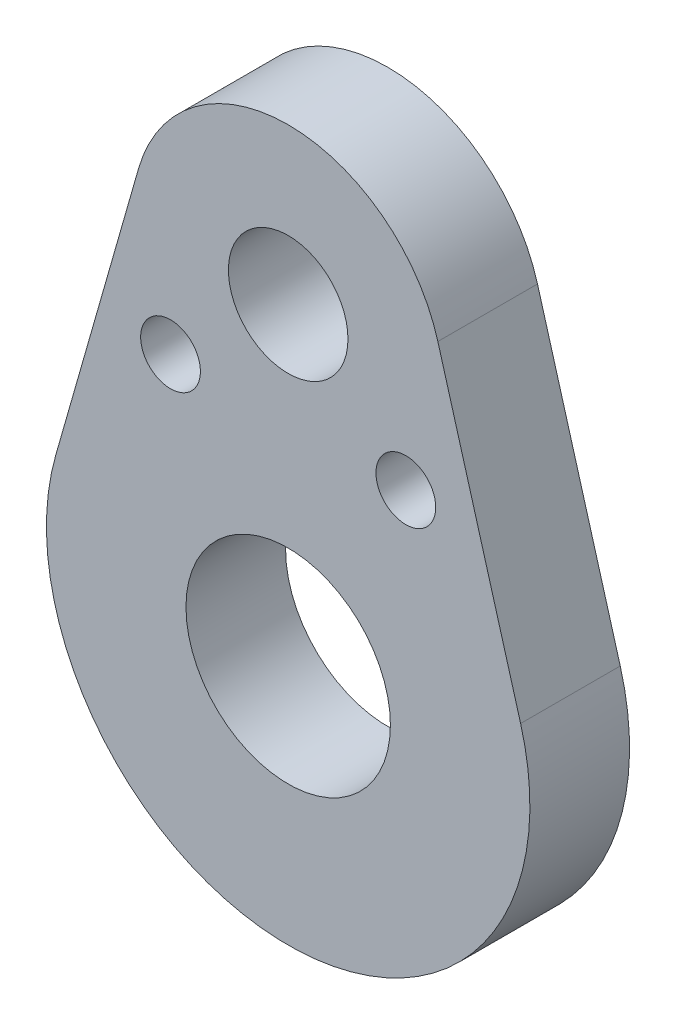
ISO-10303-21;
HEADER;
FILE_DESCRIPTION(('STEP AP214'),'2;1');
FILE_NAME('part.step','',(''),(''),'','','');
FILE_SCHEMA(('AUTOMOTIVE_DESIGN { 1 0 10303 214 1 1 1 1 }'));
ENDSEC;
DATA;
#1=APPLICATION_CONTEXT('core data for automotive mechanical design processes');
#2=APPLICATION_PROTOCOL_DEFINITION('international standard','automotive_design',2000,#1);
#3=PRODUCT_CONTEXT('',#1,'mechanical');
#4=PRODUCT('Part','Part','',(#3));
#5=PRODUCT_RELATED_PRODUCT_CATEGORY('part','',(#4));
#6=PRODUCT_DEFINITION_FORMATION('','',#4);
#7=PRODUCT_DEFINITION_CONTEXT('part definition',#1,'design');
#8=PRODUCT_DEFINITION('design','',#6,#7);
#9=PRODUCT_DEFINITION_SHAPE('','',#8);
#10=(LENGTH_UNIT() NAMED_UNIT(*) SI_UNIT(.MILLI.,.METRE.));
#11=(NAMED_UNIT(*) PLANE_ANGLE_UNIT() SI_UNIT($,.RADIAN.));
#12=(NAMED_UNIT(*) SI_UNIT($,.STERADIAN.) SOLID_ANGLE_UNIT());
#13=UNCERTAINTY_MEASURE_WITH_UNIT(LENGTH_MEASURE(1.E-05),#10,'distance_accuracy_value','');
#14=(GEOMETRIC_REPRESENTATION_CONTEXT(3) GLOBAL_UNCERTAINTY_ASSIGNED_CONTEXT((#13)) GLOBAL_UNIT_ASSIGNED_CONTEXT((#10,
#11,#12)) REPRESENTATION_CONTEXT('',''));
#15=CARTESIAN_POINT('',(0.,0.,0.));
#16=DIRECTION('',(0.,0.,1.));
#17=DIRECTION('',(1.,0.,0.));
#18=AXIS2_PLACEMENT_3D('',#15,#16,#17);
#19=CARTESIAN_POINT('',(0.,15.7136903035324,5.));
#20=DIRECTION('',(0.,0.,-1.));
#21=DIRECTION('',(-1.,0.,0.));
#22=AXIS2_PLACEMENT_3D('',#19,#20,#21);
#23=PLANE('',#22);
#24=CARTESIAN_POINT('',(0.,15.7136903035324,5.));
#25=DIRECTION('',(0.,0.,1.));
#26=DIRECTION('',(-1.,0.,0.));
#27=AXIS2_PLACEMENT_3D('',#24,#25,#26);
#28=CIRCLE('',#27,7.81260254444824);
#29=CARTESIAN_POINT('',(7.51165464801782,17.8612011804389,5.));
#30=VERTEX_POINT('',#29);
#31=CARTESIAN_POINT('',(-7.51165464801782,17.8612011804388,5.));
#32=VERTEX_POINT('',#31);
#33=EDGE_CURVE('E92',#30,#32,#28,.T.);
#34=ORIENTED_EDGE('',*,*,#33,.T.);
#35=DIRECTION('',(-0.274877784283608,-0.961479174869292,0.));
#36=VECTOR('',#35,1.);
#37=CARTESIAN_POINT('',(-7.51165464801782,17.8612011804388,5.));
#38=LINE('',#37,#36);
#39=CARTESIAN_POINT('',(-11.6646143122787,3.33480268786675,5.));
#40=VERTEX_POINT('',#39);
#41=EDGE_CURVE('E87',#32,#40,#38,.T.);
#42=ORIENTED_EDGE('',*,*,#41,.T.);
#43=CARTESIAN_POINT('',(0.,0.,5.));
#44=DIRECTION('',(0.,0.,1.));
#45=DIRECTION('',(-1.,0.,0.));
#46=AXIS2_PLACEMENT_3D('',#43,#44,#45);
#47=CIRCLE('',#46,12.1319469180021);
#48=CARTESIAN_POINT('',(11.6646143122787,3.33480268786675,5.));
#49=VERTEX_POINT('',#48);
#50=EDGE_CURVE('E90',#40,#49,#47,.T.);
#51=ORIENTED_EDGE('',*,*,#50,.T.);
#52=DIRECTION('',(-0.274877784283608,0.961479174869292,0.));
#53=VECTOR('',#52,1.);
#54=CARTESIAN_POINT('',(7.51165464801782,17.8612011804389,5.));
#55=LINE('',#54,#53);
#56=EDGE_CURVE('E57',#49,#30,#55,.T.);
#57=ORIENTED_EDGE('',*,*,#56,.T.);
#58=EDGE_LOOP('',(#34,#42,#51,#57));
#59=FACE_BOUND('',#58,.T.);
#60=CARTESIAN_POINT('',(0.,0.,5.));
#61=DIRECTION('',(0.,0.,1.));
#62=DIRECTION('',(1.,0.,0.));
#63=AXIS2_PLACEMENT_3D('',#60,#61,#62);
#64=CIRCLE('',#63,5.1298987491824);
#65=CARTESIAN_POINT('',(5.1298987491824,0.,5.));
#66=VERTEX_POINT('',#65);
#67=EDGE_CURVE('E112',#66,#66,#64,.T.);
#68=ORIENTED_EDGE('',*,*,#67,.F.);
#69=EDGE_LOOP('',(#68));
#70=FACE_BOUND('',#69,.T.);
#71=CARTESIAN_POINT('',(0.,15.7136903035324,5.));
#72=DIRECTION('',(0.,0.,1.));
#73=DIRECTION('',(1.,0.,0.));
#74=AXIS2_PLACEMENT_3D('',#71,#72,#73);
#75=CIRCLE('',#74,3.);
#76=CARTESIAN_POINT('',(3.,15.7136903035324,5.));
#77=VERTEX_POINT('',#76);
#78=EDGE_CURVE('E134',#77,#77,#75,.T.);
#79=ORIENTED_EDGE('',*,*,#78,.F.);
#80=EDGE_LOOP('',(#79));
#81=FACE_BOUND('',#80,.T.);
#82=CARTESIAN_POINT('',(5.90478543428235,10.5980019341528,5.));
#83=DIRECTION('',(0.,0.,1.));
#84=DIRECTION('',(1.,0.,0.));
#85=AXIS2_PLACEMENT_3D('',#82,#83,#84);
#86=CIRCLE('',#85,1.5);
#87=CARTESIAN_POINT('',(7.40478543428235,10.5980019341528,5.));
#88=VERTEX_POINT('',#87);
#89=EDGE_CURVE('E142',#88,#88,#86,.T.);
#90=ORIENTED_EDGE('',*,*,#89,.F.);
#91=EDGE_LOOP('',(#90));
#92=FACE_BOUND('',#91,.T.);
#93=CARTESIAN_POINT('',(-5.90478543428235,10.5980019341528,5.));
#94=DIRECTION('',(0.,0.,1.));
#95=DIRECTION('',(1.,0.,0.));
#96=AXIS2_PLACEMENT_3D('',#93,#94,#95);
#97=CIRCLE('',#96,1.5);
#98=CARTESIAN_POINT('',(-4.40478543428235,10.5980019341528,5.));
#99=VERTEX_POINT('',#98);
#100=EDGE_CURVE('E150',#99,#99,#97,.T.);
#101=ORIENTED_EDGE('',*,*,#100,.F.);
#102=EDGE_LOOP('',(#101));
#103=FACE_BOUND('',#102,.T.);
#104=ADVANCED_FACE('F39',(#59,#70,#81,#92,#103),#23,.F.);
#105=CARTESIAN_POINT('',(0.,15.7136903035324,0.));
#106=DIRECTION('',(0.,0.,-1.));
#107=DIRECTION('',(-1.,0.,0.));
#108=AXIS2_PLACEMENT_3D('',#105,#106,#107);
#109=PLANE('',#108);
#110=CARTESIAN_POINT('',(5.90478543428235,10.5980019341528,0.));
#111=DIRECTION('',(0.,0.,1.));
#112=DIRECTION('',(1.,0.,0.));
#113=AXIS2_PLACEMENT_3D('',#110,#111,#112);
#114=CIRCLE('',#113,1.5);
#115=CARTESIAN_POINT('',(7.40478543428235,10.5980019341528,0.));
#116=VERTEX_POINT('',#115);
#117=EDGE_CURVE('E146',#116,#116,#114,.T.);
#118=ORIENTED_EDGE('',*,*,#117,.T.);
#119=EDGE_LOOP('',(#118));
#120=FACE_BOUND('',#119,.T.);
#121=CARTESIAN_POINT('',(0.,0.,0.));
#122=DIRECTION('',(0.,0.,1.));
#123=DIRECTION('',(1.,0.,0.));
#124=AXIS2_PLACEMENT_3D('',#121,#122,#123);
#125=CIRCLE('',#124,5.1298987491824);
#126=CARTESIAN_POINT('',(5.1298987491824,0.,0.));
#127=VERTEX_POINT('',#126);
#128=EDGE_CURVE('E130',#127,#127,#125,.T.);
#129=ORIENTED_EDGE('',*,*,#128,.T.);
#130=EDGE_LOOP('',(#129));
#131=FACE_BOUND('',#130,.T.);
#132=CARTESIAN_POINT('',(0.,15.7136903035324,0.));
#133=DIRECTION('',(0.,0.,1.));
#134=DIRECTION('',(-1.,0.,0.));
#135=AXIS2_PLACEMENT_3D('',#132,#133,#134);
#136=CIRCLE('',#135,7.81260254444824);
#137=CARTESIAN_POINT('',(7.51165464801782,17.8612011804389,0.));
#138=VERTEX_POINT('',#137);
#139=CARTESIAN_POINT('',(-7.51165464801782,17.8612011804388,0.));
#140=VERTEX_POINT('',#139);
#141=EDGE_CURVE('E108',#138,#140,#136,.T.);
#142=ORIENTED_EDGE('',*,*,#141,.F.);
#143=DIRECTION('',(-0.274877784283608,0.961479174869292,0.));
#144=VECTOR('',#143,1.);
#145=CARTESIAN_POINT('',(7.51165464801782,17.8612011804389,0.));
#146=LINE('',#145,#144);
#147=CARTESIAN_POINT('',(11.6646143122787,3.33480268786675,0.));
#148=VERTEX_POINT('',#147);
#149=EDGE_CURVE('E80',#148,#138,#146,.T.);
#150=ORIENTED_EDGE('',*,*,#149,.F.);
#151=CARTESIAN_POINT('',(0.,0.,0.));
#152=DIRECTION('',(0.,0.,1.));
#153=DIRECTION('',(-1.,0.,0.));
#154=AXIS2_PLACEMENT_3D('',#151,#152,#153);
#155=CIRCLE('',#154,12.1319469180021);
#156=CARTESIAN_POINT('',(-11.6646143122787,3.33480268786675,0.));
#157=VERTEX_POINT('',#156);
#158=EDGE_CURVE('E74',#157,#148,#155,.T.);
#159=ORIENTED_EDGE('',*,*,#158,.F.);
#160=DIRECTION('',(-0.274877784283608,-0.961479174869292,0.));
#161=VECTOR('',#160,1.);
#162=CARTESIAN_POINT('',(-7.51165464801782,17.8612011804388,0.));
#163=LINE('',#162,#161);
#164=EDGE_CURVE('E97',#140,#157,#163,.T.);
#165=ORIENTED_EDGE('',*,*,#164,.F.);
#166=EDGE_LOOP('',(#142,#150,#159,#165));
#167=FACE_BOUND('',#166,.T.);
#168=CARTESIAN_POINT('',(0.,15.7136903035324,0.));
#169=DIRECTION('',(0.,0.,1.));
#170=DIRECTION('',(1.,0.,0.));
#171=AXIS2_PLACEMENT_3D('',#168,#169,#170);
#172=CIRCLE('',#171,3.);
#173=CARTESIAN_POINT('',(3.,15.7136903035324,0.));
#174=VERTEX_POINT('',#173);
#175=EDGE_CURVE('E138',#174,#174,#172,.T.);
#176=ORIENTED_EDGE('',*,*,#175,.T.);
#177=EDGE_LOOP('',(#176));
#178=FACE_BOUND('',#177,.T.);
#179=CARTESIAN_POINT('',(-5.90478543428235,10.5980019341528,0.));
#180=DIRECTION('',(0.,0.,1.));
#181=DIRECTION('',(1.,0.,0.));
#182=AXIS2_PLACEMENT_3D('',#179,#180,#181);
#183=CIRCLE('',#182,1.5);
#184=CARTESIAN_POINT('',(-4.40478543428235,10.5980019341528,0.));
#185=VERTEX_POINT('',#184);
#186=EDGE_CURVE('E154',#185,#185,#183,.T.);
#187=ORIENTED_EDGE('',*,*,#186,.T.);
#188=EDGE_LOOP('',(#187));
#189=FACE_BOUND('',#188,.T.);
#190=ADVANCED_FACE('F125',(#120,#131,#167,#178,#189),#109,.T.);
#191=CARTESIAN_POINT('',(0.,15.7136903035324,5.));
#192=DIRECTION('',(0.,0.,-1.));
#193=DIRECTION('',(-1.,0.,0.));
#194=AXIS2_PLACEMENT_3D('',#191,#192,#193);
#195=CYLINDRICAL_SURFACE('',#194,7.81260254444824);
#196=ORIENTED_EDGE('',*,*,#141,.T.);
#197=DIRECTION('',(0.,0.,-1.));
#198=VECTOR('',#197,1.);
#199=CARTESIAN_POINT('',(-7.51165464801782,17.8612011804388,5.));
#200=LINE('',#199,#198);
#201=EDGE_CURVE('E11',#32,#140,#200,.T.);
#202=ORIENTED_EDGE('',*,*,#201,.F.);
#203=ORIENTED_EDGE('',*,*,#33,.F.);
#204=DIRECTION('',(0.,0.,-1.));
#205=VECTOR('',#204,1.);
#206=CARTESIAN_POINT('',(7.51165464801782,17.8612011804389,5.));
#207=LINE('',#206,#205);
#208=EDGE_CURVE('E104',#30,#138,#207,.T.);
#209=ORIENTED_EDGE('',*,*,#208,.T.);
#210=EDGE_LOOP('',(#196,#202,#203,#209));
#211=FACE_BOUND('',#210,.T.);
#212=ADVANCED_FACE('F41',(#211),#195,.T.);
#213=CARTESIAN_POINT('',(-7.51165464801782,17.8612011804388,5.));
#214=DIRECTION('',(0.961479174869292,-0.274877784283608,0.));
#215=DIRECTION('',(0.274877784283608,0.961479174869292,0.));
#216=AXIS2_PLACEMENT_3D('',#213,#214,#215);
#217=PLANE('',#216);
#218=ORIENTED_EDGE('',*,*,#164,.T.);
#219=DIRECTION('',(0.,0.,-1.));
#220=VECTOR('',#219,1.);
#221=CARTESIAN_POINT('',(-11.6646143122787,3.33480268786675,5.));
#222=LINE('',#221,#220);
#223=EDGE_CURVE('E49',#40,#157,#222,.T.);
#224=ORIENTED_EDGE('',*,*,#223,.F.);
#225=ORIENTED_EDGE('',*,*,#41,.F.);
#226=ORIENTED_EDGE('',*,*,#201,.T.);
#227=EDGE_LOOP('',(#218,#224,#225,#226));
#228=FACE_BOUND('',#227,.T.);
#229=ADVANCED_FACE('F96',(#228),#217,.F.);
#230=CARTESIAN_POINT('',(0.,0.,5.));
#231=DIRECTION('',(0.,0.,-1.));
#232=DIRECTION('',(-1.,0.,0.));
#233=AXIS2_PLACEMENT_3D('',#230,#231,#232);
#234=CYLINDRICAL_SURFACE('',#233,12.1319469180021);
#235=ORIENTED_EDGE('',*,*,#158,.T.);
#236=DIRECTION('',(0.,0.,-1.));
#237=VECTOR('',#236,1.);
#238=CARTESIAN_POINT('',(11.6646143122787,3.33480268786675,5.));
#239=LINE('',#238,#237);
#240=EDGE_CURVE('E99',#49,#148,#239,.T.);
#241=ORIENTED_EDGE('',*,*,#240,.F.);
#242=ORIENTED_EDGE('',*,*,#50,.F.);
#243=ORIENTED_EDGE('',*,*,#223,.T.);
#244=EDGE_LOOP('',(#235,#241,#242,#243));
#245=FACE_BOUND('',#244,.T.);
#246=ADVANCED_FACE('F100',(#245),#234,.T.);
#247=CARTESIAN_POINT('',(7.51165464801782,17.8612011804389,5.));
#248=DIRECTION('',(-0.961479174869292,-0.274877784283608,0.));
#249=DIRECTION('',(0.274877784283608,-0.961479174869292,0.));
#250=AXIS2_PLACEMENT_3D('',#247,#248,#249);
#251=PLANE('',#250);
#252=ORIENTED_EDGE('',*,*,#149,.T.);
#253=ORIENTED_EDGE('',*,*,#208,.F.);
#254=ORIENTED_EDGE('',*,*,#56,.F.);
#255=ORIENTED_EDGE('',*,*,#240,.T.);
#256=EDGE_LOOP('',(#252,#253,#254,#255));
#257=FACE_BOUND('',#256,.T.);
#258=ADVANCED_FACE('F122',(#257),#251,.F.);
#259=CARTESIAN_POINT('',(0.,0.,5.));
#260=DIRECTION('',(0.,0.,-1.));
#261=DIRECTION('',(-1.,0.,0.));
#262=AXIS2_PLACEMENT_3D('',#259,#260,#261);
#263=CYLINDRICAL_SURFACE('',#262,5.1298987491824);
#264=ORIENTED_EDGE('',*,*,#67,.T.);
#265=EDGE_LOOP('',(#264));
#266=FACE_BOUND('',#265,.T.);
#267=ORIENTED_EDGE('',*,*,#128,.F.);
#268=EDGE_LOOP('',(#267));
#269=FACE_BOUND('',#268,.T.);
#270=ADVANCED_FACE('F173',(#266,#269),#263,.F.);
#271=CARTESIAN_POINT('',(0.,15.7136903035324,5.));
#272=DIRECTION('',(0.,0.,-1.));
#273=DIRECTION('',(-1.,0.,0.));
#274=AXIS2_PLACEMENT_3D('',#271,#272,#273);
#275=CYLINDRICAL_SURFACE('',#274,3.);
#276=ORIENTED_EDGE('',*,*,#78,.T.);
#277=EDGE_LOOP('',(#276));
#278=FACE_BOUND('',#277,.T.);
#279=ORIENTED_EDGE('',*,*,#175,.F.);
#280=EDGE_LOOP('',(#279));
#281=FACE_BOUND('',#280,.T.);
#282=ADVANCED_FACE('F219',(#278,#281),#275,.F.);
#283=CARTESIAN_POINT('',(5.90478543428235,10.5980019341528,5.));
#284=DIRECTION('',(0.,0.,-1.));
#285=DIRECTION('',(-1.,0.,0.));
#286=AXIS2_PLACEMENT_3D('',#283,#284,#285);
#287=CYLINDRICAL_SURFACE('',#286,1.5);
#288=ORIENTED_EDGE('',*,*,#89,.T.);
#289=EDGE_LOOP('',(#288));
#290=FACE_BOUND('',#289,.T.);
#291=ORIENTED_EDGE('',*,*,#117,.F.);
#292=EDGE_LOOP('',(#291));
#293=FACE_BOUND('',#292,.T.);
#294=ADVANCED_FACE('F227',(#290,#293),#287,.F.);
#295=CARTESIAN_POINT('',(-5.90478543428235,10.5980019341528,5.));
#296=DIRECTION('',(0.,0.,-1.));
#297=DIRECTION('',(-1.,0.,0.));
#298=AXIS2_PLACEMENT_3D('',#295,#296,#297);
#299=CYLINDRICAL_SURFACE('',#298,1.5);
#300=ORIENTED_EDGE('',*,*,#100,.T.);
#301=EDGE_LOOP('',(#300));
#302=FACE_BOUND('',#301,.T.);
#303=ORIENTED_EDGE('',*,*,#186,.F.);
#304=EDGE_LOOP('',(#303));
#305=FACE_BOUND('',#304,.T.);
#306=ADVANCED_FACE('F162',(#302,#305),#299,.F.);
#307=CLOSED_SHELL('',(#104,#190,#212,#229,#246,#258,#270,#282,#294,#306));
#308=MANIFOLD_SOLID_BREP('B2',#307);
#309=ADVANCED_BREP_SHAPE_REPRESENTATION('',(#18,#308),#14);
#310=SHAPE_DEFINITION_REPRESENTATION(#9,#309);
ENDSEC;
END-ISO-10303-21;
